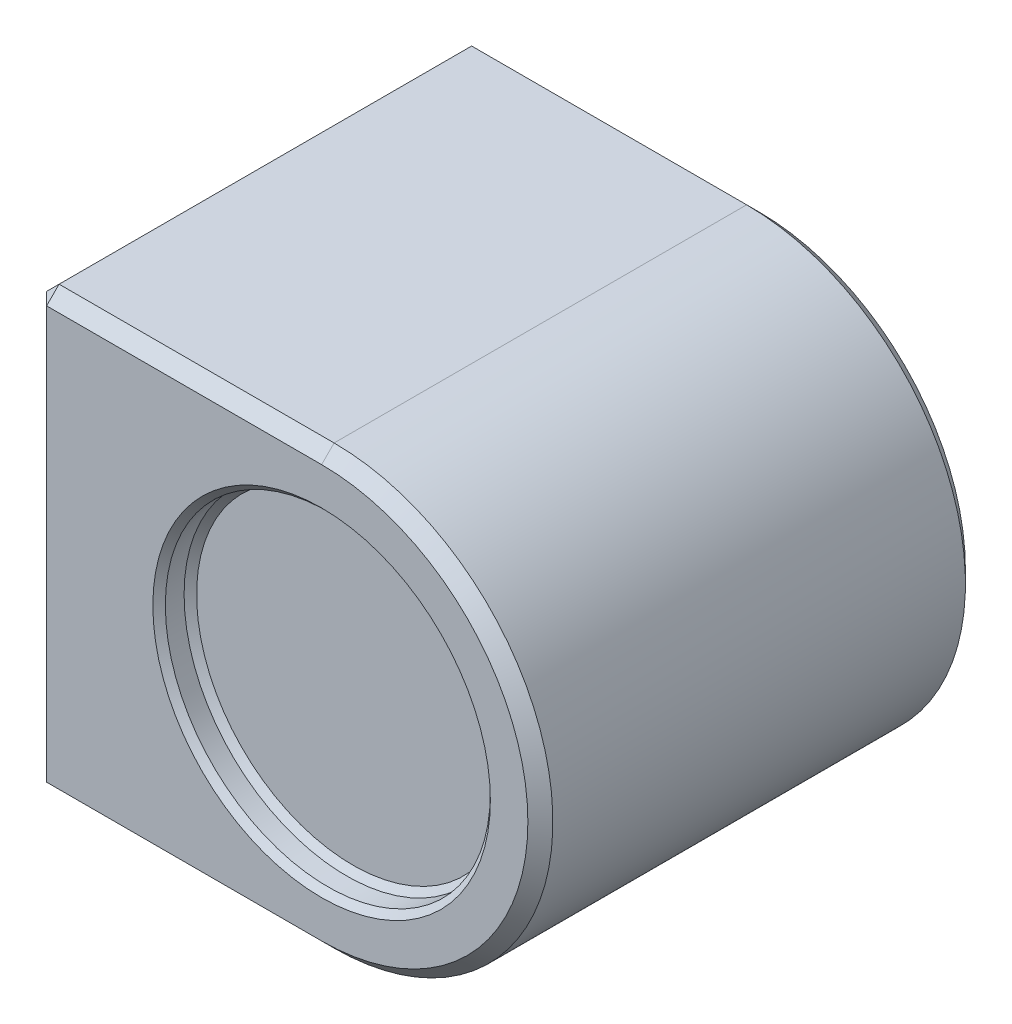
ISO-10303-21;
HEADER;
FILE_DESCRIPTION(('STEP AP214'),'2;1');
FILE_NAME('part.step','',(''),(''),'','','');
FILE_SCHEMA(('AUTOMOTIVE_DESIGN { 1 0 10303 214 1 1 1 1 }'));
ENDSEC;
DATA;
#1=APPLICATION_CONTEXT('core data for automotive mechanical design processes');
#2=APPLICATION_PROTOCOL_DEFINITION('international standard','automotive_design',2000,#1);
#3=PRODUCT_CONTEXT('',#1,'mechanical');
#4=PRODUCT('Part','Part','',(#3));
#5=PRODUCT_RELATED_PRODUCT_CATEGORY('part','',(#4));
#6=PRODUCT_DEFINITION_FORMATION('','',#4);
#7=PRODUCT_DEFINITION_CONTEXT('part definition',#1,'design');
#8=PRODUCT_DEFINITION('design','',#6,#7);
#9=PRODUCT_DEFINITION_SHAPE('','',#8);
#10=(LENGTH_UNIT() NAMED_UNIT(*) SI_UNIT(.MILLI.,.METRE.));
#11=(NAMED_UNIT(*) PLANE_ANGLE_UNIT() SI_UNIT($,.RADIAN.));
#12=(NAMED_UNIT(*) SI_UNIT($,.STERADIAN.) SOLID_ANGLE_UNIT());
#13=UNCERTAINTY_MEASURE_WITH_UNIT(LENGTH_MEASURE(1.E-05),#10,'distance_accuracy_value','');
#14=(GEOMETRIC_REPRESENTATION_CONTEXT(3) GLOBAL_UNCERTAINTY_ASSIGNED_CONTEXT((#13)) GLOBAL_UNIT_ASSIGNED_CONTEXT((#10,
#11,#12)) REPRESENTATION_CONTEXT('',''));
#15=CARTESIAN_POINT('',(0.,0.,0.));
#16=DIRECTION('',(0.,0.,1.));
#17=DIRECTION('',(1.,0.,0.));
#18=AXIS2_PLACEMENT_3D('',#15,#16,#17);
#19=CARTESIAN_POINT('',(0.,0.,-70.));
#20=DIRECTION('',(0.,0.,1.));
#21=DIRECTION('',(1.,0.,0.));
#22=AXIS2_PLACEMENT_3D('',#19,#20,#21);
#23=CYLINDRICAL_SURFACE('',#22,35.);
#24=DIRECTION('',(0.,0.,1.));
#25=VECTOR('',#24,1.);
#26=CARTESIAN_POINT('',(0.,35.,-70.));
#27=LINE('',#26,#25);
#28=CARTESIAN_POINT('',(0.,35.,-68.));
#29=VERTEX_POINT('',#28);
#30=CARTESIAN_POINT('',(0.,35.,-2.));
#31=VERTEX_POINT('',#30);
#32=EDGE_CURVE('E148',#29,#31,#27,.T.);
#33=ORIENTED_EDGE('',*,*,#32,.T.);
#34=CARTESIAN_POINT('',(0.,0.,-2.));
#35=DIRECTION('',(0.,0.,-1.));
#36=DIRECTION('',(-1.,0.,0.));
#37=AXIS2_PLACEMENT_3D('',#34,#35,#36);
#38=CIRCLE('',#37,35.);
#39=CARTESIAN_POINT('',(0.,-35.,-2.));
#40=VERTEX_POINT('',#39);
#41=EDGE_CURVE('E145',#31,#40,#38,.T.);
#42=ORIENTED_EDGE('',*,*,#41,.T.);
#43=DIRECTION('',(0.,0.,1.));
#44=VECTOR('',#43,1.);
#45=CARTESIAN_POINT('',(0.,-35.,-70.));
#46=LINE('',#45,#44);
#47=CARTESIAN_POINT('',(0.,-35.,-68.));
#48=VERTEX_POINT('',#47);
#49=EDGE_CURVE('E131',#48,#40,#46,.T.);
#50=ORIENTED_EDGE('',*,*,#49,.F.);
#51=CARTESIAN_POINT('',(0.,0.,-68.));
#52=DIRECTION('',(0.,0.,-1.));
#53=DIRECTION('',(-1.,0.,0.));
#54=AXIS2_PLACEMENT_3D('',#51,#52,#53);
#55=CIRCLE('',#54,35.);
#56=EDGE_CURVE('E138',#48,#29,#55,.F.);
#57=ORIENTED_EDGE('',*,*,#56,.T.);
#58=EDGE_LOOP('',(#33,#42,#50,#57));
#59=FACE_BOUND('',#58,.T.);
#60=ADVANCED_FACE('F32',(#59),#23,.T.);
#61=CARTESIAN_POINT('',(-46.,-35.,-70.));
#62=DIRECTION('',(0.,1.,0.));
#63=DIRECTION('',(1.,0.,0.));
#64=AXIS2_PLACEMENT_3D('',#61,#62,#63);
#65=PLANE('',#64);
#66=ORIENTED_EDGE('',*,*,#49,.T.);
#67=DIRECTION('',(-1.,0.,0.));
#68=VECTOR('',#67,1.);
#69=CARTESIAN_POINT('',(-46.,-35.,-2.));
#70=LINE('',#69,#68);
#71=CARTESIAN_POINT('',(-44.,-35.,-2.));
#72=VERTEX_POINT('',#71);
#73=EDGE_CURVE('E135',#40,#72,#70,.T.);
#74=ORIENTED_EDGE('',*,*,#73,.T.);
#75=DIRECTION('',(0.,0.,-1.));
#76=VECTOR('',#75,1.);
#77=CARTESIAN_POINT('',(-44.,-35.,-70.));
#78=LINE('',#77,#76);
#79=CARTESIAN_POINT('',(-44.,-35.,-68.));
#80=VERTEX_POINT('',#79);
#81=EDGE_CURVE('E134',#72,#80,#78,.T.);
#82=ORIENTED_EDGE('',*,*,#81,.T.);
#83=DIRECTION('',(1.,0.,0.));
#84=VECTOR('',#83,1.);
#85=CARTESIAN_POINT('',(0.,-35.,-68.));
#86=LINE('',#85,#84);
#87=EDGE_CURVE('E115',#80,#48,#86,.T.);
#88=ORIENTED_EDGE('',*,*,#87,.T.);
#89=EDGE_LOOP('',(#66,#74,#82,#88));
#90=FACE_BOUND('',#89,.T.);
#91=ADVANCED_FACE('F128',(#90),#65,.F.);
#92=CARTESIAN_POINT('',(-46.,35.,-70.));
#93=DIRECTION('',(1.,0.,0.));
#94=DIRECTION('',(0.,0.,-1.));
#95=AXIS2_PLACEMENT_3D('',#92,#93,#94);
#96=PLANE('',#95);
#97=CARTESIAN_POINT('',(-46.,0.,-38.));
#98=DIRECTION('',(1.,0.,0.));
#99=DIRECTION('',(0.,0.,-1.));
#100=AXIS2_PLACEMENT_3D('',#97,#98,#99);
#101=CIRCLE('',#100,26.);
#102=CARTESIAN_POINT('',(-46.,0.,-64.));
#103=VERTEX_POINT('',#102);
#104=EDGE_CURVE('E40',#103,#103,#101,.T.);
#105=ORIENTED_EDGE('',*,*,#104,.T.);
#106=EDGE_LOOP('',(#105));
#107=FACE_BOUND('',#106,.T.);
#108=DIRECTION('',(0.,-1.,0.));
#109=VECTOR('',#108,1.);
#110=CARTESIAN_POINT('',(-46.,-35.,-68.));
#111=LINE('',#110,#109);
#112=CARTESIAN_POINT('',(-46.,33.,-68.));
#113=VERTEX_POINT('',#112);
#114=CARTESIAN_POINT('',(-46.,-33.,-68.));
#115=VERTEX_POINT('',#114);
#116=EDGE_CURVE('E176',#113,#115,#111,.T.);
#117=ORIENTED_EDGE('',*,*,#116,.T.);
#118=DIRECTION('',(0.,0.,1.));
#119=VECTOR('',#118,1.);
#120=CARTESIAN_POINT('',(-46.,-33.,-70.));
#121=LINE('',#120,#119);
#122=CARTESIAN_POINT('',(-46.,-33.,-1.99999999999999));
#123=VERTEX_POINT('',#122);
#124=EDGE_CURVE('E185',#115,#123,#121,.T.);
#125=ORIENTED_EDGE('',*,*,#124,.T.);
#126=DIRECTION('',(0.,1.,0.));
#127=VECTOR('',#126,1.);
#128=CARTESIAN_POINT('',(-46.,35.,-1.99999999999999));
#129=LINE('',#128,#127);
#130=CARTESIAN_POINT('',(-46.,33.,-1.99999999999999));
#131=VERTEX_POINT('',#130);
#132=EDGE_CURVE('E182',#123,#131,#129,.T.);
#133=ORIENTED_EDGE('',*,*,#132,.T.);
#134=DIRECTION('',(0.,0.,-1.));
#135=VECTOR('',#134,1.);
#136=CARTESIAN_POINT('',(-46.,33.,-70.));
#137=LINE('',#136,#135);
#138=EDGE_CURVE('E179',#131,#113,#137,.T.);
#139=ORIENTED_EDGE('',*,*,#138,.T.);
#140=EDGE_LOOP('',(#117,#125,#133,#139));
#141=FACE_BOUND('',#140,.T.);
#142=ADVANCED_FACE('F244',(#107,#141),#96,.F.);
#143=CARTESIAN_POINT('',(0.,35.,-70.));
#144=DIRECTION('',(0.,-1.,0.));
#145=DIRECTION('',(-1.,0.,0.));
#146=AXIS2_PLACEMENT_3D('',#143,#144,#145);
#147=PLANE('',#146);
#148=DIRECTION('',(0.,0.,1.));
#149=VECTOR('',#148,1.);
#150=CARTESIAN_POINT('',(-44.,35.,-70.));
#151=LINE('',#150,#149);
#152=CARTESIAN_POINT('',(-44.,35.,-68.));
#153=VERTEX_POINT('',#152);
#154=CARTESIAN_POINT('',(-44.,35.,-2.));
#155=VERTEX_POINT('',#154);
#156=EDGE_CURVE('E191',#153,#155,#151,.T.);
#157=ORIENTED_EDGE('',*,*,#156,.T.);
#158=DIRECTION('',(1.,0.,0.));
#159=VECTOR('',#158,1.);
#160=CARTESIAN_POINT('',(0.,35.,-2.));
#161=LINE('',#160,#159);
#162=EDGE_CURVE('E194',#155,#31,#161,.T.);
#163=ORIENTED_EDGE('',*,*,#162,.T.);
#164=ORIENTED_EDGE('',*,*,#32,.F.);
#165=DIRECTION('',(-1.,0.,0.));
#166=VECTOR('',#165,1.);
#167=CARTESIAN_POINT('',(-46.,35.,-68.));
#168=LINE('',#167,#166);
#169=EDGE_CURVE('E188',#29,#153,#168,.T.);
#170=ORIENTED_EDGE('',*,*,#169,.T.);
#171=EDGE_LOOP('',(#157,#163,#164,#170));
#172=FACE_BOUND('',#171,.T.);
#173=ADVANCED_FACE('F470',(#172),#147,.F.);
#174=CARTESIAN_POINT('',(0.,0.,-70.));
#175=DIRECTION('',(0.,0.,-1.));
#176=DIRECTION('',(-1.,0.,0.));
#177=AXIS2_PLACEMENT_3D('',#174,#175,#176);
#178=PLANE('',#177);
#179=CARTESIAN_POINT('',(0.,0.,-70.));
#180=DIRECTION('',(0.,0.,-1.));
#181=DIRECTION('',(-1.,0.,0.));
#182=AXIS2_PLACEMENT_3D('',#179,#180,#181);
#183=CIRCLE('',#182,33.);
#184=CARTESIAN_POINT('',(0.,33.,-70.));
#185=VERTEX_POINT('',#184);
#186=CARTESIAN_POINT('',(0.,-33.,-70.));
#187=VERTEX_POINT('',#186);
#188=EDGE_CURVE('E172',#185,#187,#183,.T.);
#189=ORIENTED_EDGE('',*,*,#188,.T.);
#190=DIRECTION('',(-1.,0.,0.));
#191=VECTOR('',#190,1.);
#192=CARTESIAN_POINT('',(-46.,-33.,-70.));
#193=LINE('',#192,#191);
#194=CARTESIAN_POINT('',(-44.,-33.,-70.));
#195=VERTEX_POINT('',#194);
#196=EDGE_CURVE('E118',#187,#195,#193,.T.);
#197=ORIENTED_EDGE('',*,*,#196,.T.);
#198=DIRECTION('',(0.,1.,0.));
#199=VECTOR('',#198,1.);
#200=CARTESIAN_POINT('',(-44.,35.,-70.));
#201=LINE('',#200,#199);
#202=CARTESIAN_POINT('',(-44.,33.,-70.));
#203=VERTEX_POINT('',#202);
#204=EDGE_CURVE('E169',#195,#203,#201,.T.);
#205=ORIENTED_EDGE('',*,*,#204,.T.);
#206=DIRECTION('',(1.,0.,0.));
#207=VECTOR('',#206,1.);
#208=CARTESIAN_POINT('',(0.,33.,-70.));
#209=LINE('',#208,#207);
#210=EDGE_CURVE('E166',#203,#185,#209,.T.);
#211=ORIENTED_EDGE('',*,*,#210,.T.);
#212=EDGE_LOOP('',(#189,#197,#205,#211));
#213=FACE_BOUND('',#212,.T.);
#214=ADVANCED_FACE('F266',(#213),#178,.T.);
#215=CARTESIAN_POINT('',(0.,0.,0.));
#216=DIRECTION('',(0.,0.,-1.));
#217=DIRECTION('',(-1.,0.,0.));
#218=AXIS2_PLACEMENT_3D('',#215,#216,#217);
#219=PLANE('',#218);
#220=CARTESIAN_POINT('',(0.,0.,0.));
#221=DIRECTION('',(0.,0.,-1.));
#222=DIRECTION('',(-1.,0.,0.));
#223=AXIS2_PLACEMENT_3D('',#220,#221,#222);
#224=CIRCLE('',#223,27.);
#225=CARTESIAN_POINT('',(-27.,0.,0.));
#226=VERTEX_POINT('',#225);
#227=EDGE_CURVE('E11',#226,#226,#224,.T.);
#228=ORIENTED_EDGE('',*,*,#227,.T.);
#229=EDGE_LOOP('',(#228));
#230=FACE_BOUND('',#229,.T.);
#231=DIRECTION('',(0.,-1.,0.));
#232=VECTOR('',#231,1.);
#233=CARTESIAN_POINT('',(-44.,0.,0.));
#234=LINE('',#233,#232);
#235=CARTESIAN_POINT('',(-44.,33.,0.));
#236=VERTEX_POINT('',#235);
#237=CARTESIAN_POINT('',(-44.,-33.,0.));
#238=VERTEX_POINT('',#237);
#239=EDGE_CURVE('E157',#236,#238,#234,.T.);
#240=ORIENTED_EDGE('',*,*,#239,.T.);
#241=DIRECTION('',(1.,0.,0.));
#242=VECTOR('',#241,1.);
#243=CARTESIAN_POINT('',(0.,-33.,0.));
#244=LINE('',#243,#242);
#245=CARTESIAN_POINT('',(0.,-33.,0.));
#246=VERTEX_POINT('',#245);
#247=EDGE_CURVE('E163',#238,#246,#244,.T.);
#248=ORIENTED_EDGE('',*,*,#247,.T.);
#249=CARTESIAN_POINT('',(0.,0.,0.));
#250=DIRECTION('',(0.,0.,-1.));
#251=DIRECTION('',(-1.,0.,0.));
#252=AXIS2_PLACEMENT_3D('',#249,#250,#251);
#253=CIRCLE('',#252,33.);
#254=CARTESIAN_POINT('',(0.,33.,0.));
#255=VERTEX_POINT('',#254);
#256=EDGE_CURVE('E160',#246,#255,#253,.F.);
#257=ORIENTED_EDGE('',*,*,#256,.T.);
#258=DIRECTION('',(-1.,0.,0.));
#259=VECTOR('',#258,1.);
#260=CARTESIAN_POINT('',(0.,33.,0.));
#261=LINE('',#260,#259);
#262=EDGE_CURVE('E154',#255,#236,#261,.T.);
#263=ORIENTED_EDGE('',*,*,#262,.T.);
#264=EDGE_LOOP('',(#240,#248,#257,#263));
#265=FACE_BOUND('',#264,.T.);
#266=ADVANCED_FACE('F256',(#230,#265),#219,.F.);
#267=CARTESIAN_POINT('',(-51.,0.,-38.));
#268=DIRECTION('',(1.,0.,0.));
#269=DIRECTION('',(0.,0.,-1.));
#270=AXIS2_PLACEMENT_3D('',#267,#268,#269);
#271=CYLINDRICAL_SURFACE('',#270,25.);
#272=CARTESIAN_POINT('',(-50.,0.,-38.));
#273=DIRECTION('',(-1.,0.,0.));
#274=DIRECTION('',(0.,0.,1.));
#275=AXIS2_PLACEMENT_3D('',#272,#273,#274);
#276=CIRCLE('',#275,25.);
#277=CARTESIAN_POINT('',(-50.,0.,-13.));
#278=VERTEX_POINT('',#277);
#279=EDGE_CURVE('E239',#278,#278,#276,.F.);
#280=ORIENTED_EDGE('',*,*,#279,.T.);
#281=EDGE_LOOP('',(#280));
#282=FACE_BOUND('',#281,.T.);
#283=CARTESIAN_POINT('',(-47.,0.,-38.));
#284=DIRECTION('',(1.,0.,0.));
#285=DIRECTION('',(0.,0.,-1.));
#286=AXIS2_PLACEMENT_3D('',#283,#284,#285);
#287=CIRCLE('',#286,25.);
#288=CARTESIAN_POINT('',(-47.,0.,-63.));
#289=VERTEX_POINT('',#288);
#290=EDGE_CURVE('E236',#289,#289,#287,.F.);
#291=ORIENTED_EDGE('',*,*,#290,.T.);
#292=EDGE_LOOP('',(#291));
#293=FACE_BOUND('',#292,.T.);
#294=ADVANCED_FACE('F253',(#282,#293),#271,.T.);
#295=CARTESIAN_POINT('',(-51.,0.,-38.));
#296=DIRECTION('',(-1.,0.,0.));
#297=DIRECTION('',(0.,0.,1.));
#298=AXIS2_PLACEMENT_3D('',#295,#296,#297);
#299=PLANE('',#298);
#300=CARTESIAN_POINT('',(-51.,0.,-38.));
#301=DIRECTION('',(-1.,0.,0.));
#302=DIRECTION('',(0.,0.,1.));
#303=AXIS2_PLACEMENT_3D('',#300,#301,#302);
#304=CIRCLE('',#303,24.);
#305=CARTESIAN_POINT('',(-51.,0.,-14.));
#306=VERTEX_POINT('',#305);
#307=EDGE_CURVE('E233',#306,#306,#304,.T.);
#308=ORIENTED_EDGE('',*,*,#307,.T.);
#309=EDGE_LOOP('',(#308));
#310=FACE_BOUND('',#309,.T.);
#311=ADVANCED_FACE('F255',(#310),#299,.T.);
#312=CARTESIAN_POINT('',(0.,33.,-70.));
#313=DIRECTION('',(0.,0.70710678118655,-0.707106781186545));
#314=DIRECTION('',(-1.,0.,0.));
#315=AXIS2_PLACEMENT_3D('',#312,#313,#314);
#316=PLANE('',#315);
#317=DIRECTION('',(0.,-0.707106781186545,-0.70710678118655));
#318=VECTOR('',#317,1.);
#319=CARTESIAN_POINT('',(-44.,34.,-69.));
#320=LINE('',#319,#318);
#321=EDGE_CURVE('E123',#153,#203,#320,.T.);
#322=ORIENTED_EDGE('',*,*,#321,.F.);
#323=ORIENTED_EDGE('',*,*,#169,.F.);
#324=DIRECTION('',(0.,0.707106781186545,0.70710678118655));
#325=VECTOR('',#324,1.);
#326=CARTESIAN_POINT('',(0.,33.,-70.));
#327=LINE('',#326,#325);
#328=EDGE_CURVE('E140',#185,#29,#327,.T.);
#329=ORIENTED_EDGE('',*,*,#328,.F.);
#330=ORIENTED_EDGE('',*,*,#210,.F.);
#331=EDGE_LOOP('',(#322,#323,#329,#330));
#332=FACE_BOUND('',#331,.T.);
#333=ADVANCED_FACE('F263',(#332),#316,.T.);
#334=CARTESIAN_POINT('',(0.,0.,-70.));
#335=DIRECTION('',(0.,0.,1.));
#336=DIRECTION('',(1.,0.,0.));
#337=AXIS2_PLACEMENT_3D('',#334,#335,#336);
#338=CONICAL_SURFACE('',#337,33.,0.785398163397445);
#339=ORIENTED_EDGE('',*,*,#328,.T.);
#340=ORIENTED_EDGE('',*,*,#56,.F.);
#341=DIRECTION('',(0.,-0.707106781186545,0.70710678118655));
#342=VECTOR('',#341,1.);
#343=CARTESIAN_POINT('',(0.,-33.,-70.));
#344=LINE('',#343,#342);
#345=EDGE_CURVE('E111',#187,#48,#344,.T.);
#346=ORIENTED_EDGE('',*,*,#345,.F.);
#347=ORIENTED_EDGE('',*,*,#188,.F.);
#348=EDGE_LOOP('',(#339,#340,#346,#347));
#349=FACE_BOUND('',#348,.T.);
#350=ADVANCED_FACE('F139',(#349),#338,.T.);
#351=CARTESIAN_POINT('',(-46.,33.,-68.));
#352=DIRECTION('',(-0.577350269189626,0.57735026918963,-0.577350269189622));
#353=DIRECTION('',(0.70710678118655,0.707106781186545,0.));
#354=AXIS2_PLACEMENT_3D('',#351,#352,#353);
#355=PLANE('',#354);
#356=DIRECTION('',(-0.70710678118655,-0.707106781186545,0.));
#357=VECTOR('',#356,1.);
#358=CARTESIAN_POINT('',(-46.,33.,-68.));
#359=LINE('',#358,#357);
#360=EDGE_CURVE('E55',#153,#113,#359,.T.);
#361=ORIENTED_EDGE('',*,*,#360,.F.);
#362=ORIENTED_EDGE('',*,*,#321,.T.);
#363=DIRECTION('',(-0.707106781186545,0.,0.70710678118655));
#364=VECTOR('',#363,1.);
#365=CARTESIAN_POINT('',(-46.,33.,-68.));
#366=LINE('',#365,#364);
#367=EDGE_CURVE('E124',#113,#203,#366,.F.);
#368=ORIENTED_EDGE('',*,*,#367,.F.);
#369=EDGE_LOOP('',(#361,#362,#368));
#370=FACE_BOUND('',#369,.T.);
#371=ADVANCED_FACE('F320',(#370),#355,.T.);
#372=CARTESIAN_POINT('',(0.,-33.,-70.));
#373=DIRECTION('',(0.,-0.70710678118655,-0.707106781186545));
#374=DIRECTION('',(1.,0.,0.));
#375=AXIS2_PLACEMENT_3D('',#372,#373,#374);
#376=PLANE('',#375);
#377=ORIENTED_EDGE('',*,*,#345,.T.);
#378=ORIENTED_EDGE('',*,*,#87,.F.);
#379=DIRECTION('',(0.,-0.707106781186545,0.70710678118655));
#380=VECTOR('',#379,1.);
#381=CARTESIAN_POINT('',(-44.,-33.,-70.));
#382=LINE('',#381,#380);
#383=EDGE_CURVE('E218',#195,#80,#382,.T.);
#384=ORIENTED_EDGE('',*,*,#383,.F.);
#385=ORIENTED_EDGE('',*,*,#196,.F.);
#386=EDGE_LOOP('',(#377,#378,#384,#385));
#387=FACE_BOUND('',#386,.T.);
#388=ADVANCED_FACE('F113',(#387),#376,.T.);
#389=CARTESIAN_POINT('',(-44.,0.,-70.));
#390=DIRECTION('',(-0.70710678118655,0.,-0.707106781186545));
#391=DIRECTION('',(0.,-1.,0.));
#392=AXIS2_PLACEMENT_3D('',#389,#390,#391);
#393=PLANE('',#392);
#394=ORIENTED_EDGE('',*,*,#367,.T.);
#395=ORIENTED_EDGE('',*,*,#204,.F.);
#396=DIRECTION('',(0.707106781186545,0.,-0.70710678118655));
#397=VECTOR('',#396,1.);
#398=CARTESIAN_POINT('',(-44.,-33.,-70.));
#399=LINE('',#398,#397);
#400=EDGE_CURVE('E216',#115,#195,#399,.T.);
#401=ORIENTED_EDGE('',*,*,#400,.F.);
#402=ORIENTED_EDGE('',*,*,#116,.F.);
#403=EDGE_LOOP('',(#394,#395,#401,#402));
#404=FACE_BOUND('',#403,.T.);
#405=ADVANCED_FACE('F313',(#404),#393,.T.);
#406=CARTESIAN_POINT('',(-44.,35.,-70.));
#407=DIRECTION('',(0.707106781186545,-0.70710678118655,0.));
#408=DIRECTION('',(0.,0.,1.));
#409=AXIS2_PLACEMENT_3D('',#406,#407,#408);
#410=PLANE('',#409);
#411=ORIENTED_EDGE('',*,*,#360,.T.);
#412=ORIENTED_EDGE('',*,*,#138,.F.);
#413=DIRECTION('',(0.70710678118655,0.707106781186545,0.));
#414=VECTOR('',#413,1.);
#415=CARTESIAN_POINT('',(-46.,33.,-1.99999999999999));
#416=LINE('',#415,#414);
#417=EDGE_CURVE('E214',#155,#131,#416,.F.);
#418=ORIENTED_EDGE('',*,*,#417,.F.);
#419=ORIENTED_EDGE('',*,*,#156,.F.);
#420=EDGE_LOOP('',(#411,#412,#418,#419));
#421=FACE_BOUND('',#420,.T.);
#422=ADVANCED_FACE('F309',(#421),#410,.F.);
#423=CARTESIAN_POINT('',(-44.,-33.,-70.));
#424=DIRECTION('',(-0.577350269189626,-0.57735026918963,-0.577350269189622));
#425=DIRECTION('',(-0.70710678118655,0.707106781186545,0.));
#426=AXIS2_PLACEMENT_3D('',#423,#424,#425);
#427=PLANE('',#426);
#428=ORIENTED_EDGE('',*,*,#400,.T.);
#429=ORIENTED_EDGE('',*,*,#383,.T.);
#430=DIRECTION('',(0.70710678118655,-0.707106781186545,0.));
#431=VECTOR('',#430,1.);
#432=CARTESIAN_POINT('',(-45.,-34.,-68.));
#433=LINE('',#432,#431);
#434=EDGE_CURVE('E211',#115,#80,#433,.T.);
#435=ORIENTED_EDGE('',*,*,#434,.F.);
#436=EDGE_LOOP('',(#428,#429,#435));
#437=FACE_BOUND('',#436,.T.);
#438=ADVANCED_FACE('F306',(#437),#427,.T.);
#439=CARTESIAN_POINT('',(-46.,33.,-1.99999999999999));
#440=DIRECTION('',(-0.577350269189622,0.57735026918963,0.577350269189626));
#441=DIRECTION('',(0.,0.707106781186545,-0.70710678118655));
#442=AXIS2_PLACEMENT_3D('',#439,#440,#441);
#443=PLANE('',#442);
#444=DIRECTION('',(-0.70710678118655,0.,-0.707106781186545));
#445=VECTOR('',#444,1.);
#446=CARTESIAN_POINT('',(-46.,33.,-1.99999999999999));
#447=LINE('',#446,#445);
#448=EDGE_CURVE('E209',#236,#131,#447,.T.);
#449=ORIENTED_EDGE('',*,*,#448,.F.);
#450=DIRECTION('',(0.,-0.707106781186545,0.70710678118655));
#451=VECTOR('',#450,1.);
#452=CARTESIAN_POINT('',(-44.,34.,-1.));
#453=LINE('',#452,#451);
#454=EDGE_CURVE('E47',#155,#236,#453,.T.);
#455=ORIENTED_EDGE('',*,*,#454,.F.);
#456=ORIENTED_EDGE('',*,*,#417,.T.);
#457=EDGE_LOOP('',(#449,#455,#456));
#458=FACE_BOUND('',#457,.T.);
#459=ADVANCED_FACE('F302',(#458),#443,.T.);
#460=CARTESIAN_POINT('',(0.,35.,-2.));
#461=DIRECTION('',(0.,-0.70710678118655,-0.707106781186545));
#462=DIRECTION('',(1.,0.,0.));
#463=AXIS2_PLACEMENT_3D('',#460,#461,#462);
#464=PLANE('',#463);
#465=ORIENTED_EDGE('',*,*,#454,.T.);
#466=ORIENTED_EDGE('',*,*,#262,.F.);
#467=DIRECTION('',(0.,-0.707106781186545,0.70710678118655));
#468=VECTOR('',#467,1.);
#469=CARTESIAN_POINT('',(0.,35.,-2.));
#470=LINE('',#469,#468);
#471=EDGE_CURVE('E207',#31,#255,#470,.T.);
#472=ORIENTED_EDGE('',*,*,#471,.F.);
#473=ORIENTED_EDGE('',*,*,#162,.F.);
#474=EDGE_LOOP('',(#465,#466,#472,#473));
#475=FACE_BOUND('',#474,.T.);
#476=ADVANCED_FACE('F298',(#475),#464,.F.);
#477=CARTESIAN_POINT('',(-46.,-33.,-70.));
#478=DIRECTION('',(0.707106781186545,0.70710678118655,0.));
#479=DIRECTION('',(0.,0.,1.));
#480=AXIS2_PLACEMENT_3D('',#477,#478,#479);
#481=PLANE('',#480);
#482=ORIENTED_EDGE('',*,*,#434,.T.);
#483=ORIENTED_EDGE('',*,*,#81,.F.);
#484=DIRECTION('',(-0.70710678118655,0.707106781186545,0.));
#485=VECTOR('',#484,1.);
#486=CARTESIAN_POINT('',(-44.,-35.,-2.));
#487=LINE('',#486,#485);
#488=EDGE_CURVE('E204',#123,#72,#487,.F.);
#489=ORIENTED_EDGE('',*,*,#488,.F.);
#490=ORIENTED_EDGE('',*,*,#124,.F.);
#491=EDGE_LOOP('',(#482,#483,#489,#490));
#492=FACE_BOUND('',#491,.T.);
#493=ADVANCED_FACE('F294',(#492),#481,.F.);
#494=CARTESIAN_POINT('',(-46.,35.,-1.99999999999999));
#495=DIRECTION('',(0.707106781186545,0.,-0.70710678118655));
#496=DIRECTION('',(0.,1.,0.));
#497=AXIS2_PLACEMENT_3D('',#494,#495,#496);
#498=PLANE('',#497);
#499=ORIENTED_EDGE('',*,*,#448,.T.);
#500=ORIENTED_EDGE('',*,*,#132,.F.);
#501=DIRECTION('',(0.70710678118655,0.,0.707106781186545));
#502=VECTOR('',#501,1.);
#503=CARTESIAN_POINT('',(-45.,-33.,-0.999999999999994));
#504=LINE('',#503,#502);
#505=EDGE_CURVE('E202',#238,#123,#504,.F.);
#506=ORIENTED_EDGE('',*,*,#505,.F.);
#507=ORIENTED_EDGE('',*,*,#239,.F.);
#508=EDGE_LOOP('',(#499,#500,#506,#507));
#509=FACE_BOUND('',#508,.T.);
#510=ADVANCED_FACE('F290',(#509),#498,.F.);
#511=CARTESIAN_POINT('',(0.,0.,-2.));
#512=DIRECTION('',(0.,0.,-1.));
#513=DIRECTION('',(-1.,0.,0.));
#514=AXIS2_PLACEMENT_3D('',#511,#512,#513);
#515=CONICAL_SURFACE('',#514,35.,0.785398163397445);
#516=ORIENTED_EDGE('',*,*,#471,.T.);
#517=ORIENTED_EDGE('',*,*,#256,.F.);
#518=DIRECTION('',(0.,0.707106781186545,0.70710678118655));
#519=VECTOR('',#518,1.);
#520=CARTESIAN_POINT('',(0.,-35.,-2.));
#521=LINE('',#520,#519);
#522=EDGE_CURVE('E200',#40,#246,#521,.T.);
#523=ORIENTED_EDGE('',*,*,#522,.F.);
#524=ORIENTED_EDGE('',*,*,#41,.F.);
#525=EDGE_LOOP('',(#516,#517,#523,#524));
#526=FACE_BOUND('',#525,.T.);
#527=ADVANCED_FACE('F286',(#526),#515,.T.);
#528=CARTESIAN_POINT('',(-44.,-35.,-2.));
#529=DIRECTION('',(-0.577350269189622,-0.57735026918963,0.577350269189626));
#530=DIRECTION('',(0.,0.707106781186545,0.70710678118655));
#531=AXIS2_PLACEMENT_3D('',#528,#529,#530);
#532=PLANE('',#531);
#533=ORIENTED_EDGE('',*,*,#505,.T.);
#534=ORIENTED_EDGE('',*,*,#488,.T.);
#535=DIRECTION('',(0.,-0.707106781186545,-0.70710678118655));
#536=VECTOR('',#535,1.);
#537=CARTESIAN_POINT('',(-44.,-35.,-2.));
#538=LINE('',#537,#536);
#539=EDGE_CURVE('E198',#238,#72,#538,.T.);
#540=ORIENTED_EDGE('',*,*,#539,.F.);
#541=EDGE_LOOP('',(#533,#534,#540));
#542=FACE_BOUND('',#541,.T.);
#543=ADVANCED_FACE('F282',(#542),#532,.T.);
#544=CARTESIAN_POINT('',(-46.,-35.,-2.));
#545=DIRECTION('',(0.,0.70710678118655,-0.707106781186545));
#546=DIRECTION('',(-1.,0.,0.));
#547=AXIS2_PLACEMENT_3D('',#544,#545,#546);
#548=PLANE('',#547);
#549=ORIENTED_EDGE('',*,*,#522,.T.);
#550=ORIENTED_EDGE('',*,*,#247,.F.);
#551=ORIENTED_EDGE('',*,*,#539,.T.);
#552=ORIENTED_EDGE('',*,*,#73,.F.);
#553=EDGE_LOOP('',(#549,#550,#551,#552));
#554=FACE_BOUND('',#553,.T.);
#555=ADVANCED_FACE('F278',(#554),#548,.F.);
#556=CARTESIAN_POINT('',(0.,0.,-5.));
#557=DIRECTION('',(0.,0.,1.));
#558=DIRECTION('',(1.,0.,0.));
#559=AXIS2_PLACEMENT_3D('',#556,#557,#558);
#560=CYLINDRICAL_SURFACE('',#559,26.);
#561=CARTESIAN_POINT('',(0.,0.,-4.));
#562=DIRECTION('',(0.,0.,1.));
#563=DIRECTION('',(1.,0.,0.));
#564=AXIS2_PLACEMENT_3D('',#561,#562,#563);
#565=CIRCLE('',#564,26.);
#566=CARTESIAN_POINT('',(26.,0.,-4.));
#567=VERTEX_POINT('',#566);
#568=EDGE_CURVE('E230',#567,#567,#565,.F.);
#569=ORIENTED_EDGE('',*,*,#568,.T.);
#570=EDGE_LOOP('',(#569));
#571=FACE_BOUND('',#570,.T.);
#572=CARTESIAN_POINT('',(0.,0.,-1.00000000000001));
#573=DIRECTION('',(0.,0.,-1.));
#574=DIRECTION('',(-1.,0.,0.));
#575=AXIS2_PLACEMENT_3D('',#572,#573,#574);
#576=CIRCLE('',#575,26.);
#577=CARTESIAN_POINT('',(-26.,0.,-1.00000000000001));
#578=VERTEX_POINT('',#577);
#579=EDGE_CURVE('E227',#578,#578,#576,.F.);
#580=ORIENTED_EDGE('',*,*,#579,.T.);
#581=EDGE_LOOP('',(#580));
#582=FACE_BOUND('',#581,.T.);
#583=ADVANCED_FACE('F281',(#571,#582),#560,.F.);
#584=CARTESIAN_POINT('',(0.,0.,-5.));
#585=DIRECTION('',(0.,0.,1.));
#586=DIRECTION('',(1.,0.,0.));
#587=AXIS2_PLACEMENT_3D('',#584,#585,#586);
#588=PLANE('',#587);
#589=CARTESIAN_POINT('',(0.,0.,-5.));
#590=DIRECTION('',(0.,0.,1.));
#591=DIRECTION('',(1.,0.,0.));
#592=AXIS2_PLACEMENT_3D('',#589,#590,#591);
#593=CIRCLE('',#592,25.);
#594=CARTESIAN_POINT('',(25.,0.,-5.));
#595=VERTEX_POINT('',#594);
#596=EDGE_CURVE('E197',#595,#595,#593,.T.);
#597=ORIENTED_EDGE('',*,*,#596,.T.);
#598=EDGE_LOOP('',(#597));
#599=FACE_BOUND('',#598,.T.);
#600=ADVANCED_FACE('F331',(#599),#588,.T.);
#601=CARTESIAN_POINT('',(0.,0.,-5.));
#602=DIRECTION('',(0.,0.,1.));
#603=DIRECTION('',(1.,0.,0.));
#604=AXIS2_PLACEMENT_3D('',#601,#602,#603);
#605=CONICAL_SURFACE('',#604,25.,0.78539816339745);
#606=ORIENTED_EDGE('',*,*,#568,.F.);
#607=EDGE_LOOP('',(#606));
#608=FACE_BOUND('',#607,.T.);
#609=ORIENTED_EDGE('',*,*,#596,.F.);
#610=EDGE_LOOP('',(#609));
#611=FACE_BOUND('',#610,.T.);
#612=ADVANCED_FACE('F328',(#608,#611),#605,.F.);
#613=CARTESIAN_POINT('',(-51.,0.,-38.));
#614=DIRECTION('',(1.,0.,0.));
#615=DIRECTION('',(0.,0.,-1.));
#616=AXIS2_PLACEMENT_3D('',#613,#614,#615);
#617=CONICAL_SURFACE('',#616,24.,0.785398163397459);
#618=ORIENTED_EDGE('',*,*,#279,.F.);
#619=EDGE_LOOP('',(#618));
#620=FACE_BOUND('',#619,.T.);
#621=ORIENTED_EDGE('',*,*,#307,.F.);
#622=EDGE_LOOP('',(#621));
#623=FACE_BOUND('',#622,.T.);
#624=ADVANCED_FACE('F250',(#620,#623),#617,.T.);
#625=CARTESIAN_POINT('',(-47.,0.,-38.));
#626=DIRECTION('',(1.,0.,0.));
#627=DIRECTION('',(0.,0.,-1.));
#628=AXIS2_PLACEMENT_3D('',#625,#626,#627);
#629=CONICAL_SURFACE('',#628,25.,0.785398163397431);
#630=ORIENTED_EDGE('',*,*,#104,.F.);
#631=EDGE_LOOP('',(#630));
#632=FACE_BOUND('',#631,.T.);
#633=ORIENTED_EDGE('',*,*,#290,.F.);
#634=EDGE_LOOP('',(#633));
#635=FACE_BOUND('',#634,.T.);
#636=ADVANCED_FACE('F247',(#632,#635),#629,.T.);
#637=CARTESIAN_POINT('',(0.,0.,-1.00000000000001));
#638=DIRECTION('',(0.,0.,1.));
#639=DIRECTION('',(1.,0.,0.));
#640=AXIS2_PLACEMENT_3D('',#637,#638,#639);
#641=CONICAL_SURFACE('',#640,26.,0.785398163397447);
#642=ORIENTED_EDGE('',*,*,#227,.F.);
#643=EDGE_LOOP('',(#642));
#644=FACE_BOUND('',#643,.T.);
#645=ORIENTED_EDGE('',*,*,#579,.F.);
#646=EDGE_LOOP('',(#645));
#647=FACE_BOUND('',#646,.T.);
#648=ADVANCED_FACE('F34',(#644,#647),#641,.F.);
#649=CLOSED_SHELL('',(#60,#91,#142,#173,#214,#266,#294,#311,#333,#350,#371,#388,#405,#422,#438,
#459,#476,#493,#510,#527,#543,#555,#583,#600,#612,#624,#636,#648));
#650=MANIFOLD_SOLID_BREP('B2',#649);
#651=ADVANCED_BREP_SHAPE_REPRESENTATION('',(#18,#650),#14);
#652=SHAPE_DEFINITION_REPRESENTATION(#9,#651);
ENDSEC;
END-ISO-10303-21;
